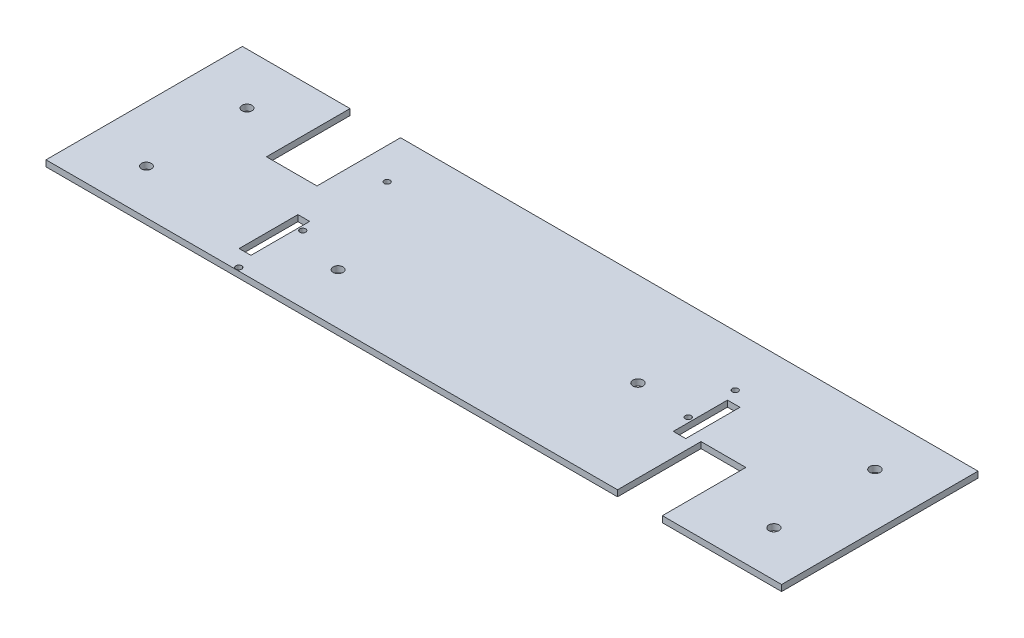
ISO-10303-21;
HEADER;
FILE_DESCRIPTION(('STEP AP214'),'2;1');
FILE_NAME('part.step','',(''),(''),'','','');
FILE_SCHEMA(('AUTOMOTIVE_DESIGN { 1 0 10303 214 1 1 1 1 }'));
ENDSEC;
DATA;
#1=APPLICATION_CONTEXT('core data for automotive mechanical design processes');
#2=APPLICATION_PROTOCOL_DEFINITION('international standard','automotive_design',2000,#1);
#3=PRODUCT_CONTEXT('',#1,'mechanical');
#4=PRODUCT('Part','Part','',(#3));
#5=PRODUCT_RELATED_PRODUCT_CATEGORY('part','',(#4));
#6=PRODUCT_DEFINITION_FORMATION('','',#4);
#7=PRODUCT_DEFINITION_CONTEXT('part definition',#1,'design');
#8=PRODUCT_DEFINITION('design','',#6,#7);
#9=PRODUCT_DEFINITION_SHAPE('','',#8);
#10=(LENGTH_UNIT() NAMED_UNIT(*) SI_UNIT(.MILLI.,.METRE.));
#11=(NAMED_UNIT(*) PLANE_ANGLE_UNIT() SI_UNIT($,.RADIAN.));
#12=(NAMED_UNIT(*) SI_UNIT($,.STERADIAN.) SOLID_ANGLE_UNIT());
#13=UNCERTAINTY_MEASURE_WITH_UNIT(LENGTH_MEASURE(1.E-05),#10,'distance_accuracy_value','');
#14=(GEOMETRIC_REPRESENTATION_CONTEXT(3) GLOBAL_UNCERTAINTY_ASSIGNED_CONTEXT((#13)) GLOBAL_UNIT_ASSIGNED_CONTEXT((#10,
#11,#12)) REPRESENTATION_CONTEXT('',''));
#15=CARTESIAN_POINT('',(0.,0.,0.));
#16=DIRECTION('',(0.,0.,1.));
#17=DIRECTION('',(1.,0.,0.));
#18=AXIS2_PLACEMENT_3D('',#15,#16,#17);
#19=CARTESIAN_POINT('',(-191.516,3.175,50.8));
#20=DIRECTION('',(0.,0.,-1.));
#21=DIRECTION('',(-1.,0.,0.));
#22=AXIS2_PLACEMENT_3D('',#19,#20,#21);
#23=PLANE('',#22);
#24=DIRECTION('',(1.,0.,0.));
#25=VECTOR('',#24,1.);
#26=CARTESIAN_POINT('',(-191.516,3.175,50.8));
#27=LINE('',#26,#25);
#28=CARTESIAN_POINT('',(-189.030522811123,3.175,50.8));
#29=VERTEX_POINT('',#28);
#30=CARTESIAN_POINT('',(106.633964595742,3.175,50.8));
#31=VERTEX_POINT('',#30);
#32=EDGE_CURVE('E189',#29,#31,#27,.T.);
#33=ORIENTED_EDGE('',*,*,#32,.F.);
#34=DIRECTION('',(0.,-1.,0.));
#35=VECTOR('',#34,1.);
#36=CARTESIAN_POINT('',(-189.030522811123,3.175,50.8));
#37=LINE('',#36,#35);
#38=CARTESIAN_POINT('',(-189.030522811123,0.,50.8));
#39=VERTEX_POINT('',#38);
#40=EDGE_CURVE('E176',#29,#39,#37,.T.);
#41=ORIENTED_EDGE('',*,*,#40,.T.);
#42=DIRECTION('',(1.,0.,0.));
#43=VECTOR('',#42,1.);
#44=CARTESIAN_POINT('',(-191.516,0.,50.8));
#45=LINE('',#44,#43);
#46=CARTESIAN_POINT('',(106.633964595742,0.,50.8));
#47=VERTEX_POINT('',#46);
#48=EDGE_CURVE('E217',#39,#47,#45,.T.);
#49=ORIENTED_EDGE('',*,*,#48,.T.);
#50=DIRECTION('',(0.,1.,0.));
#51=VECTOR('',#50,1.);
#52=CARTESIAN_POINT('',(106.633964595742,-1.905,50.8));
#53=LINE('',#52,#51);
#54=EDGE_CURVE('E197',#47,#31,#53,.T.);
#55=ORIENTED_EDGE('',*,*,#54,.T.);
#56=EDGE_LOOP('',(#33,#41,#49,#55));
#57=FACE_BOUND('',#56,.T.);
#58=ADVANCED_FACE('F41',(#57),#23,.F.);
#59=CARTESIAN_POINT('',(0.,3.175,0.));
#60=DIRECTION('',(0.,-1.,0.));
#61=DIRECTION('',(0.,0.,-1.));
#62=AXIS2_PLACEMENT_3D('',#59,#60,#61);
#63=PLANE('',#62);
#64=CARTESIAN_POINT('',(64.135,3.175,-2.28599999999998));
#65=DIRECTION('',(0.,1.,0.));
#66=DIRECTION('',(0.,0.,1.));
#67=AXIS2_PLACEMENT_3D('',#64,#65,#66);
#68=CIRCLE('',#67,2.65729792765995);
#69=CARTESIAN_POINT('',(64.135,3.175,0.37129792765997));
#70=VERTEX_POINT('',#69);
#71=EDGE_CURVE('E271',#70,#70,#68,.T.);
#72=ORIENTED_EDGE('',*,*,#71,.F.);
#73=EDGE_LOOP('',(#72));
#74=FACE_BOUND('',#73,.T.);
#75=CARTESIAN_POINT('',(92.456,3.175,0.));
#76=DIRECTION('',(0.,1.,0.));
#77=DIRECTION('',(0.,0.,1.));
#78=AXIS2_PLACEMENT_3D('',#75,#76,#77);
#79=CIRCLE('',#78,1.52399999999999);
#80=CARTESIAN_POINT('',(92.456,3.175,1.52399999999999));
#81=VERTEX_POINT('',#80);
#82=EDGE_CURVE('E183',#81,#81,#79,.T.);
#83=ORIENTED_EDGE('',*,*,#82,.F.);
#84=EDGE_LOOP('',(#83));
#85=FACE_BOUND('',#84,.T.);
#86=CARTESIAN_POINT('',(164.10340160592,3.175,27.3725679526237));
#87=DIRECTION('',(0.,1.,0.));
#88=DIRECTION('',(0.,0.,1.));
#89=AXIS2_PLACEMENT_3D('',#86,#87,#88);
#90=CIRCLE('',#89,2.61409985009302);
#91=CARTESIAN_POINT('',(164.10340160592,3.175,29.9866678027167));
#92=VERTEX_POINT('',#91);
#93=EDGE_CURVE('E376',#92,#92,#90,.T.);
#94=ORIENTED_EDGE('',*,*,#93,.F.);
#95=EDGE_LOOP('',(#94));
#96=FACE_BOUND('',#95,.T.);
#97=CARTESIAN_POINT('',(164.10340160592,3.175,-24.8839194126842));
#98=DIRECTION('',(0.,1.,0.));
#99=DIRECTION('',(0.,0.,1.));
#100=AXIS2_PLACEMENT_3D('',#97,#98,#99);
#101=CIRCLE('',#100,2.65364974901954);
#102=CARTESIAN_POINT('',(164.10340160592,3.175,-22.2302696636647));
#103=VERTEX_POINT('',#102);
#104=EDGE_CURVE('E379',#103,#103,#101,.T.);
#105=ORIENTED_EDGE('',*,*,#104,.F.);
#106=EDGE_LOOP('',(#105));
#107=FACE_BOUND('',#106,.T.);
#108=CARTESIAN_POINT('',(-160.218440267836,3.175,-24.384));
#109=DIRECTION('',(0.,1.,0.));
#110=DIRECTION('',(0.,0.,1.));
#111=AXIS2_PLACEMENT_3D('',#108,#109,#110);
#112=CIRCLE('',#111,2.53999999999998);
#113=CARTESIAN_POINT('',(-160.218440267836,3.175,-21.844));
#114=VERTEX_POINT('',#113);
#115=EDGE_CURVE('E227',#114,#114,#112,.T.);
#116=ORIENTED_EDGE('',*,*,#115,.F.);
#117=EDGE_LOOP('',(#116));
#118=FACE_BOUND('',#117,.T.);
#119=CARTESIAN_POINT('',(-64.258101600192,3.175,24.4736004243686));
#120=DIRECTION('',(0.,1.,0.));
#121=DIRECTION('',(0.,0.,1.));
#122=AXIS2_PLACEMENT_3D('',#119,#120,#121);
#123=CIRCLE('',#122,2.54);
#124=CARTESIAN_POINT('',(-64.258101600192,3.175,27.0136004243686));
#125=VERTEX_POINT('',#124);
#126=EDGE_CURVE('E287',#125,#125,#123,.T.);
#127=ORIENTED_EDGE('',*,*,#126,.F.);
#128=EDGE_LOOP('',(#127));
#129=FACE_BOUND('',#128,.T.);
#130=CARTESIAN_POINT('',(-90.932,3.175,-27.5708810877318));
#131=DIRECTION('',(0.,1.,0.));
#132=DIRECTION('',(0.,0.,1.));
#133=AXIS2_PLACEMENT_3D('',#130,#131,#132);
#134=CIRCLE('',#133,1.52399999999999);
#135=CARTESIAN_POINT('',(-90.932,3.175,-26.0468810877319));
#136=VERTEX_POINT('',#135);
#137=EDGE_CURVE('E291',#136,#136,#134,.T.);
#138=ORIENTED_EDGE('',*,*,#137,.F.);
#139=EDGE_LOOP('',(#138));
#140=FACE_BOUND('',#139,.T.);
#141=CARTESIAN_POINT('',(-90.932,3.175,16.0762631729649));
#142=DIRECTION('',(0.,1.,0.));
#143=DIRECTION('',(0.,0.,1.));
#144=AXIS2_PLACEMENT_3D('',#141,#142,#143);
#145=CIRCLE('',#144,1.52399999999999);
#146=CARTESIAN_POINT('',(-90.932,3.175,17.6002631729649));
#147=VERTEX_POINT('',#146);
#148=EDGE_CURVE('E296',#147,#147,#145,.T.);
#149=ORIENTED_EDGE('',*,*,#148,.F.);
#150=EDGE_LOOP('',(#149));
#151=FACE_BOUND('',#150,.T.);
#152=CARTESIAN_POINT('',(-90.932,3.175,49.149));
#153=DIRECTION('',(0.,1.,0.));
#154=DIRECTION('',(0.,0.,1.));
#155=AXIS2_PLACEMENT_3D('',#152,#153,#154);
#156=CIRCLE('',#155,1.52399999999999);
#157=CARTESIAN_POINT('',(-90.932,3.175,50.673));
#158=VERTEX_POINT('',#157);
#159=EDGE_CURVE('E331',#158,#158,#156,.T.);
#160=ORIENTED_EDGE('',*,*,#159,.F.);
#161=EDGE_LOOP('',(#160));
#162=FACE_BOUND('',#161,.T.);
#163=DIRECTION('',(-1.,0.,0.));
#164=VECTOR('',#163,1.);
#165=CARTESIAN_POINT('',(-99.314,3.175,10.1847171604173));
#166=LINE('',#165,#164);
#167=CARTESIAN_POINT('',(-93.218,3.175,10.1847171604173));
#168=VERTEX_POINT('',#167);
#169=CARTESIAN_POINT('',(-99.314,3.175,10.1847171604173));
#170=VERTEX_POINT('',#169);
#171=EDGE_CURVE('E337',#168,#170,#166,.T.);
#172=ORIENTED_EDGE('',*,*,#171,.F.);
#173=DIRECTION('',(0.,0.,-1.));
#174=VECTOR('',#173,1.);
#175=CARTESIAN_POINT('',(-93.218,3.175,40.5996258222566));
#176=LINE('',#175,#174);
#177=CARTESIAN_POINT('',(-93.218,3.175,40.5996258222566));
#178=VERTEX_POINT('',#177);
#179=EDGE_CURVE('E314',#178,#168,#176,.T.);
#180=ORIENTED_EDGE('',*,*,#179,.F.);
#181=DIRECTION('',(1.,0.,0.));
#182=VECTOR('',#181,1.);
#183=CARTESIAN_POINT('',(-99.314,3.175,40.5996258222566));
#184=LINE('',#183,#182);
#185=CARTESIAN_POINT('',(-99.314,3.175,40.5996258222566));
#186=VERTEX_POINT('',#185);
#187=EDGE_CURVE('E324',#186,#178,#184,.T.);
#188=ORIENTED_EDGE('',*,*,#187,.F.);
#189=DIRECTION('',(0.,0.,1.));
#190=VECTOR('',#189,1.);
#191=CARTESIAN_POINT('',(-99.314,3.175,40.5996258222566));
#192=LINE('',#191,#190);
#193=EDGE_CURVE('E334',#170,#186,#192,.T.);
#194=ORIENTED_EDGE('',*,*,#193,.F.);
#195=EDGE_LOOP('',(#172,#180,#188,#194));
#196=FACE_BOUND('',#195,.T.);
#197=CARTESIAN_POINT('',(-160.218440267836,3.175,27.6640052129043));
#198=DIRECTION('',(0.,1.,0.));
#199=DIRECTION('',(0.,0.,1.));
#200=AXIS2_PLACEMENT_3D('',#197,#198,#199);
#201=CIRCLE('',#200,2.53999999999998);
#202=CARTESIAN_POINT('',(-160.218440267836,3.175,30.2040052129043));
#203=VERTEX_POINT('',#202);
#204=EDGE_CURVE('E300',#203,#203,#201,.T.);
#205=ORIENTED_EDGE('',*,*,#204,.F.);
#206=EDGE_LOOP('',(#205));
#207=FACE_BOUND('',#206,.T.);
#208=DIRECTION('',(0.,0.,1.));
#209=VECTOR('',#208,1.);
#210=CARTESIAN_POINT('',(94.8920106895122,3.175,0.));
#211=LINE('',#210,#209);
#212=CARTESIAN_POINT('',(94.8920106895122,3.175,-17.811952579015));
#213=VERTEX_POINT('',#212);
#214=CARTESIAN_POINT('',(94.8920106895122,3.175,10.2225634884164));
#215=VERTEX_POINT('',#214);
#216=EDGE_CURVE('E383',#213,#215,#211,.T.);
#217=ORIENTED_EDGE('',*,*,#216,.F.);
#218=DIRECTION('',(-1.,0.,0.));
#219=VECTOR('',#218,1.);
#220=CARTESIAN_POINT('',(0.,3.175,-17.811952579015));
#221=LINE('',#220,#219);
#222=CARTESIAN_POINT('',(101.346,3.175,-17.811952579015));
#223=VERTEX_POINT('',#222);
#224=EDGE_CURVE('E63',#223,#213,#221,.T.);
#225=ORIENTED_EDGE('',*,*,#224,.F.);
#226=DIRECTION('',(0.,0.,1.));
#227=VECTOR('',#226,1.);
#228=CARTESIAN_POINT('',(101.346,3.175,0.));
#229=LINE('',#228,#227);
#230=CARTESIAN_POINT('',(101.346,3.175,10.2225634884164));
#231=VERTEX_POINT('',#230);
#232=EDGE_CURVE('E390',#223,#231,#229,.T.);
#233=ORIENTED_EDGE('',*,*,#232,.T.);
#234=DIRECTION('',(-1.,0.,0.));
#235=VECTOR('',#234,1.);
#236=CARTESIAN_POINT('',(0.,3.175,10.2225634884164));
#237=LINE('',#236,#235);
#238=EDGE_CURVE('E387',#231,#215,#237,.T.);
#239=ORIENTED_EDGE('',*,*,#238,.T.);
#240=EDGE_LOOP('',(#217,#225,#233,#239));
#241=FACE_BOUND('',#240,.T.);
#242=CARTESIAN_POINT('',(92.456,3.175,-24.257));
#243=DIRECTION('',(0.,1.,0.));
#244=DIRECTION('',(0.,0.,1.));
#245=AXIS2_PLACEMENT_3D('',#242,#243,#244);
#246=CIRCLE('',#245,1.52399999999999);
#247=CARTESIAN_POINT('',(92.456,3.175,-22.733));
#248=VERTEX_POINT('',#247);
#249=EDGE_CURVE('E384',#248,#248,#246,.T.);
#250=ORIENTED_EDGE('',*,*,#249,.F.);
#251=EDGE_LOOP('',(#250));
#252=FACE_BOUND('',#251,.T.);
#253=DIRECTION('',(-1.,0.,0.));
#254=VECTOR('',#253,1.);
#255=CARTESIAN_POINT('',(-191.516,3.175,-50.8));
#256=LINE('',#255,#254);
#257=CARTESIAN_POINT('',(-133.35,3.175,-50.8));
#258=VERTEX_POINT('',#257);
#259=CARTESIAN_POINT('',(-189.030522811123,3.175,-50.8));
#260=VERTEX_POINT('',#259);
#261=EDGE_CURVE('E193',#258,#260,#256,.T.);
#262=ORIENTED_EDGE('',*,*,#261,.T.);
#263=DIRECTION('',(0.,0.,-1.));
#264=VECTOR('',#263,1.);
#265=CARTESIAN_POINT('',(-189.030522811123,3.175,-60.1541890343234));
#266=LINE('',#265,#264);
#267=EDGE_CURVE('E56',#29,#260,#266,.T.);
#268=ORIENTED_EDGE('',*,*,#267,.F.);
#269=ORIENTED_EDGE('',*,*,#32,.T.);
#270=DIRECTION('',(0.,0.,-1.));
#271=VECTOR('',#270,1.);
#272=CARTESIAN_POINT('',(106.633964595742,3.175,0.));
#273=LINE('',#272,#271);
#274=CARTESIAN_POINT('',(106.633964595742,3.175,7.6006303310307));
#275=VERTEX_POINT('',#274);
#276=EDGE_CURVE('E403',#31,#275,#273,.T.);
#277=ORIENTED_EDGE('',*,*,#276,.T.);
#278=DIRECTION('',(-1.,0.,0.));
#279=VECTOR('',#278,1.);
#280=CARTESIAN_POINT('',(0.,3.175,7.6006303310307));
#281=LINE('',#280,#279);
#282=CARTESIAN_POINT('',(129.827988680307,3.175,7.6006303310307));
#283=VERTEX_POINT('',#282);
#284=EDGE_CURVE('E408',#283,#275,#281,.T.);
#285=ORIENTED_EDGE('',*,*,#284,.F.);
#286=DIRECTION('',(0.,0.,-1.));
#287=VECTOR('',#286,1.);
#288=CARTESIAN_POINT('',(129.827988680307,3.175,0.));
#289=LINE('',#288,#287);
#290=CARTESIAN_POINT('',(129.827988680307,3.175,50.8));
#291=VERTEX_POINT('',#290);
#292=EDGE_CURVE('E405',#291,#283,#289,.T.);
#293=ORIENTED_EDGE('',*,*,#292,.F.);
#294=CARTESIAN_POINT('',(191.516,3.175,50.8));
#295=VERTEX_POINT('',#294);
#296=EDGE_CURVE('E199',#291,#295,#27,.T.);
#297=ORIENTED_EDGE('',*,*,#296,.T.);
#298=DIRECTION('',(0.,0.,-1.));
#299=VECTOR('',#298,1.);
#300=CARTESIAN_POINT('',(191.516,3.175,50.8));
#301=LINE('',#300,#299);
#302=CARTESIAN_POINT('',(191.516,3.175,-50.8));
#303=VERTEX_POINT('',#302);
#304=EDGE_CURVE('E218',#295,#303,#301,.T.);
#305=ORIENTED_EDGE('',*,*,#304,.T.);
#306=CARTESIAN_POINT('',(-107.221756317346,3.175,-50.8));
#307=VERTEX_POINT('',#306);
#308=EDGE_CURVE('E204',#303,#307,#256,.T.);
#309=ORIENTED_EDGE('',*,*,#308,.T.);
#310=DIRECTION('',(0.,0.,-1.));
#311=VECTOR('',#310,1.);
#312=CARTESIAN_POINT('',(-107.221756317346,3.175,-50.8));
#313=LINE('',#312,#311);
#314=CARTESIAN_POINT('',(-107.221756317346,3.175,-7.57432346763659));
#315=VERTEX_POINT('',#314);
#316=EDGE_CURVE('E306',#315,#307,#313,.T.);
#317=ORIENTED_EDGE('',*,*,#316,.F.);
#318=DIRECTION('',(1.,0.,0.));
#319=VECTOR('',#318,1.);
#320=CARTESIAN_POINT('',(-133.35,3.175,-7.57432346763659));
#321=LINE('',#320,#319);
#322=CARTESIAN_POINT('',(-133.35,3.175,-7.57432346763659));
#323=VERTEX_POINT('',#322);
#324=EDGE_CURVE('E316',#323,#315,#321,.T.);
#325=ORIENTED_EDGE('',*,*,#324,.F.);
#326=DIRECTION('',(0.,0.,1.));
#327=VECTOR('',#326,1.);
#328=CARTESIAN_POINT('',(-133.35,3.175,-50.8));
#329=LINE('',#328,#327);
#330=EDGE_CURVE('E303',#258,#323,#329,.T.);
#331=ORIENTED_EDGE('',*,*,#330,.F.);
#332=EDGE_LOOP('',(#262,#268,#269,#277,#285,#293,#297,#305,#309,#317,#325,#331));
#333=FACE_BOUND('',#332,.T.);
#334=ADVANCED_FACE('F187',(#74,#85,#96,#107,#118,#129,#140,#151,#162,#196,#207,#241,#252,#333),
#63,.F.);
#335=CARTESIAN_POINT('',(0.,0.,0.));
#336=DIRECTION('',(0.,-1.,0.));
#337=DIRECTION('',(0.,0.,-1.));
#338=AXIS2_PLACEMENT_3D('',#335,#336,#337);
#339=PLANE('',#338);
#340=DIRECTION('',(0.,0.,1.));
#341=VECTOR('',#340,1.);
#342=CARTESIAN_POINT('',(-189.030522811123,0.,0.));
#343=LINE('',#342,#341);
#344=CARTESIAN_POINT('',(-189.030522811123,0.,-50.8));
#345=VERTEX_POINT('',#344);
#346=EDGE_CURVE('E179',#345,#39,#343,.T.);
#347=ORIENTED_EDGE('',*,*,#346,.F.);
#348=DIRECTION('',(-1.,0.,0.));
#349=VECTOR('',#348,1.);
#350=CARTESIAN_POINT('',(-191.516,0.,-50.8));
#351=LINE('',#350,#349);
#352=CARTESIAN_POINT('',(-133.35,0.,-50.8));
#353=VERTEX_POINT('',#352);
#354=EDGE_CURVE('E211',#353,#345,#351,.T.);
#355=ORIENTED_EDGE('',*,*,#354,.F.);
#356=DIRECTION('',(0.,0.,-1.));
#357=VECTOR('',#356,1.);
#358=CARTESIAN_POINT('',(-133.35,0.,0.));
#359=LINE('',#358,#357);
#360=CARTESIAN_POINT('',(-133.35,0.,-7.57432346763659));
#361=VERTEX_POINT('',#360);
#362=EDGE_CURVE('E252',#361,#353,#359,.T.);
#363=ORIENTED_EDGE('',*,*,#362,.F.);
#364=DIRECTION('',(-1.,0.,0.));
#365=VECTOR('',#364,1.);
#366=CARTESIAN_POINT('',(0.,0.,-7.57432346763659));
#367=LINE('',#366,#365);
#368=CARTESIAN_POINT('',(-107.221756317346,0.,-7.57432346763659));
#369=VERTEX_POINT('',#368);
#370=EDGE_CURVE('E247',#369,#361,#367,.T.);
#371=ORIENTED_EDGE('',*,*,#370,.F.);
#372=DIRECTION('',(0.,0.,1.));
#373=VECTOR('',#372,1.);
#374=CARTESIAN_POINT('',(-107.221756317346,0.,0.));
#375=LINE('',#374,#373);
#376=CARTESIAN_POINT('',(-107.221756317346,0.,-50.8));
#377=VERTEX_POINT('',#376);
#378=EDGE_CURVE('E249',#377,#369,#375,.T.);
#379=ORIENTED_EDGE('',*,*,#378,.F.);
#380=CARTESIAN_POINT('',(191.516,0.,-50.8));
#381=VERTEX_POINT('',#380);
#382=EDGE_CURVE('E213',#381,#377,#351,.T.);
#383=ORIENTED_EDGE('',*,*,#382,.F.);
#384=DIRECTION('',(0.,0.,-1.));
#385=VECTOR('',#384,1.);
#386=CARTESIAN_POINT('',(191.516,0.,50.8));
#387=LINE('',#386,#385);
#388=CARTESIAN_POINT('',(191.516,0.,50.8));
#389=VERTEX_POINT('',#388);
#390=EDGE_CURVE('E208',#389,#381,#387,.T.);
#391=ORIENTED_EDGE('',*,*,#390,.F.);
#392=CARTESIAN_POINT('',(129.827988680307,0.,50.8));
#393=VERTEX_POINT('',#392);
#394=EDGE_CURVE('E216',#393,#389,#45,.T.);
#395=ORIENTED_EDGE('',*,*,#394,.F.);
#396=DIRECTION('',(0.,0.,1.));
#397=VECTOR('',#396,1.);
#398=CARTESIAN_POINT('',(129.827988680307,0.,0.));
#399=LINE('',#398,#397);
#400=CARTESIAN_POINT('',(129.827988680307,0.,7.6006303310307));
#401=VERTEX_POINT('',#400);
#402=EDGE_CURVE('E266',#401,#393,#399,.T.);
#403=ORIENTED_EDGE('',*,*,#402,.F.);
#404=DIRECTION('',(1.,0.,0.));
#405=VECTOR('',#404,1.);
#406=CARTESIAN_POINT('',(0.,0.,7.6006303310307));
#407=LINE('',#406,#405);
#408=CARTESIAN_POINT('',(106.633964595742,0.,7.6006303310307));
#409=VERTEX_POINT('',#408);
#410=EDGE_CURVE('E273',#409,#401,#407,.T.);
#411=ORIENTED_EDGE('',*,*,#410,.F.);
#412=DIRECTION('',(0.,0.,1.));
#413=VECTOR('',#412,1.);
#414=CARTESIAN_POINT('',(106.633964595742,0.,0.));
#415=LINE('',#414,#413);
#416=EDGE_CURVE('E49',#409,#47,#415,.T.);
#417=ORIENTED_EDGE('',*,*,#416,.T.);
#418=ORIENTED_EDGE('',*,*,#48,.F.);
#419=EDGE_LOOP('',(#347,#355,#363,#371,#379,#383,#391,#395,#403,#411,#417,#418));
#420=FACE_BOUND('',#419,.T.);
#421=CARTESIAN_POINT('',(64.135,0.,-2.28599999999998));
#422=DIRECTION('',(0.,-1.,0.));
#423=DIRECTION('',(0.,0.,-1.));
#424=AXIS2_PLACEMENT_3D('',#421,#422,#423);
#425=CIRCLE('',#424,2.65729792765995);
#426=CARTESIAN_POINT('',(64.135,0.,-4.94329792765993));
#427=VERTEX_POINT('',#426);
#428=EDGE_CURVE('E285',#427,#427,#425,.T.);
#429=ORIENTED_EDGE('',*,*,#428,.F.);
#430=EDGE_LOOP('',(#429));
#431=FACE_BOUND('',#430,.T.);
#432=CARTESIAN_POINT('',(92.456,0.,0.));
#433=DIRECTION('',(0.,-1.,0.));
#434=DIRECTION('',(0.,0.,-1.));
#435=AXIS2_PLACEMENT_3D('',#432,#433,#434);
#436=CIRCLE('',#435,1.52399999999999);
#437=CARTESIAN_POINT('',(92.456,0.,-1.52399999999999));
#438=VERTEX_POINT('',#437);
#439=EDGE_CURVE('E283',#438,#438,#436,.T.);
#440=ORIENTED_EDGE('',*,*,#439,.F.);
#441=EDGE_LOOP('',(#440));
#442=FACE_BOUND('',#441,.T.);
#443=CARTESIAN_POINT('',(164.10340160592,0.,27.3725679526237));
#444=DIRECTION('',(0.,-1.,0.));
#445=DIRECTION('',(0.,0.,-1.));
#446=AXIS2_PLACEMENT_3D('',#443,#444,#445);
#447=CIRCLE('',#446,2.61409985009302);
#448=CARTESIAN_POINT('',(164.10340160592,0.,24.7584681025306));
#449=VERTEX_POINT('',#448);
#450=EDGE_CURVE('E280',#449,#449,#447,.T.);
#451=ORIENTED_EDGE('',*,*,#450,.F.);
#452=EDGE_LOOP('',(#451));
#453=FACE_BOUND('',#452,.T.);
#454=CARTESIAN_POINT('',(164.10340160592,0.,-24.8839194126842));
#455=DIRECTION('',(0.,-1.,0.));
#456=DIRECTION('',(0.,0.,-1.));
#457=AXIS2_PLACEMENT_3D('',#454,#455,#456);
#458=CIRCLE('',#457,2.65364974901954);
#459=CARTESIAN_POINT('',(164.10340160592,0.,-27.5375691617038));
#460=VERTEX_POINT('',#459);
#461=EDGE_CURVE('E270',#460,#460,#458,.T.);
#462=ORIENTED_EDGE('',*,*,#461,.F.);
#463=EDGE_LOOP('',(#462));
#464=FACE_BOUND('',#463,.T.);
#465=CARTESIAN_POINT('',(92.456,0.,-24.257));
#466=DIRECTION('',(0.,-1.,0.));
#467=DIRECTION('',(0.,0.,-1.));
#468=AXIS2_PLACEMENT_3D('',#465,#466,#467);
#469=CIRCLE('',#468,1.52399999999999);
#470=CARTESIAN_POINT('',(92.456,0.,-25.781));
#471=VERTEX_POINT('',#470);
#472=EDGE_CURVE('E267',#471,#471,#469,.T.);
#473=ORIENTED_EDGE('',*,*,#472,.F.);
#474=EDGE_LOOP('',(#473));
#475=FACE_BOUND('',#474,.T.);
#476=DIRECTION('',(1.,0.,0.));
#477=VECTOR('',#476,1.);
#478=CARTESIAN_POINT('',(0.,0.,-17.811952579015));
#479=LINE('',#478,#477);
#480=CARTESIAN_POINT('',(94.8920106895122,0.,-17.811952579015));
#481=VERTEX_POINT('',#480);
#482=CARTESIAN_POINT('',(101.346,0.,-17.811952579015));
#483=VERTEX_POINT('',#482);
#484=EDGE_CURVE('E264',#481,#483,#479,.T.);
#485=ORIENTED_EDGE('',*,*,#484,.F.);
#486=DIRECTION('',(0.,0.,-1.));
#487=VECTOR('',#486,1.);
#488=CARTESIAN_POINT('',(94.8920106895122,0.,0.));
#489=LINE('',#488,#487);
#490=CARTESIAN_POINT('',(94.8920106895122,0.,10.2225634884164));
#491=VERTEX_POINT('',#490);
#492=EDGE_CURVE('E254',#491,#481,#489,.T.);
#493=ORIENTED_EDGE('',*,*,#492,.F.);
#494=DIRECTION('',(1.,0.,0.));
#495=VECTOR('',#494,1.);
#496=CARTESIAN_POINT('',(0.,0.,10.2225634884164));
#497=LINE('',#496,#495);
#498=CARTESIAN_POINT('',(101.346,0.,10.2225634884164));
#499=VERTEX_POINT('',#498);
#500=EDGE_CURVE('E258',#491,#499,#497,.T.);
#501=ORIENTED_EDGE('',*,*,#500,.T.);
#502=DIRECTION('',(0.,0.,-1.));
#503=VECTOR('',#502,1.);
#504=CARTESIAN_POINT('',(101.346,0.,0.));
#505=LINE('',#504,#503);
#506=EDGE_CURVE('E261',#499,#483,#505,.T.);
#507=ORIENTED_EDGE('',*,*,#506,.T.);
#508=EDGE_LOOP('',(#485,#493,#501,#507));
#509=FACE_BOUND('',#508,.T.);
#510=CARTESIAN_POINT('',(-160.218440267836,0.,27.6640052129043));
#511=DIRECTION('',(0.,-1.,0.));
#512=DIRECTION('',(0.,0.,-1.));
#513=AXIS2_PLACEMENT_3D('',#510,#511,#512);
#514=CIRCLE('',#513,2.53999999999998);
#515=CARTESIAN_POINT('',(-160.218440267836,0.,25.1240052129043));
#516=VERTEX_POINT('',#515);
#517=EDGE_CURVE('E212',#516,#516,#514,.T.);
#518=ORIENTED_EDGE('',*,*,#517,.F.);
#519=EDGE_LOOP('',(#518));
#520=FACE_BOUND('',#519,.T.);
#521=DIRECTION('',(0.,0.,1.));
#522=VECTOR('',#521,1.);
#523=CARTESIAN_POINT('',(-93.218,0.,0.));
#524=LINE('',#523,#522);
#525=CARTESIAN_POINT('',(-93.218,0.,10.1847171604173));
#526=VERTEX_POINT('',#525);
#527=CARTESIAN_POINT('',(-93.218,0.,40.5996258222566));
#528=VERTEX_POINT('',#527);
#529=EDGE_CURVE('E245',#526,#528,#524,.T.);
#530=ORIENTED_EDGE('',*,*,#529,.F.);
#531=DIRECTION('',(1.,0.,0.));
#532=VECTOR('',#531,1.);
#533=CARTESIAN_POINT('',(0.,0.,10.1847171604173));
#534=LINE('',#533,#532);
#535=CARTESIAN_POINT('',(-99.314,0.,10.1847171604173));
#536=VERTEX_POINT('',#535);
#537=EDGE_CURVE('E222',#536,#526,#534,.T.);
#538=ORIENTED_EDGE('',*,*,#537,.F.);
#539=DIRECTION('',(0.,0.,-1.));
#540=VECTOR('',#539,1.);
#541=CARTESIAN_POINT('',(-99.314,0.,0.));
#542=LINE('',#541,#540);
#543=CARTESIAN_POINT('',(-99.314,0.,40.5996258222566));
#544=VERTEX_POINT('',#543);
#545=EDGE_CURVE('E240',#544,#536,#542,.T.);
#546=ORIENTED_EDGE('',*,*,#545,.F.);
#547=DIRECTION('',(-1.,0.,0.));
#548=VECTOR('',#547,1.);
#549=CARTESIAN_POINT('',(0.,0.,40.5996258222566));
#550=LINE('',#549,#548);
#551=EDGE_CURVE('E243',#528,#544,#550,.T.);
#552=ORIENTED_EDGE('',*,*,#551,.F.);
#553=EDGE_LOOP('',(#530,#538,#546,#552));
#554=FACE_BOUND('',#553,.T.);
#555=CARTESIAN_POINT('',(-90.932,0.,49.149));
#556=DIRECTION('',(0.,-1.,0.));
#557=DIRECTION('',(0.,0.,-1.));
#558=AXIS2_PLACEMENT_3D('',#555,#556,#557);
#559=CIRCLE('',#558,1.52399999999999);
#560=CARTESIAN_POINT('',(-90.932,0.,47.625));
#561=VERTEX_POINT('',#560);
#562=EDGE_CURVE('E236',#561,#561,#559,.T.);
#563=ORIENTED_EDGE('',*,*,#562,.F.);
#564=EDGE_LOOP('',(#563));
#565=FACE_BOUND('',#564,.T.);
#566=CARTESIAN_POINT('',(-90.932,0.,16.0762631729649));
#567=DIRECTION('',(0.,-1.,0.));
#568=DIRECTION('',(0.,0.,-1.));
#569=AXIS2_PLACEMENT_3D('',#566,#567,#568);
#570=CIRCLE('',#569,1.52399999999999);
#571=CARTESIAN_POINT('',(-90.932,0.,14.5522631729649));
#572=VERTEX_POINT('',#571);
#573=EDGE_CURVE('E233',#572,#572,#570,.T.);
#574=ORIENTED_EDGE('',*,*,#573,.F.);
#575=EDGE_LOOP('',(#574));
#576=FACE_BOUND('',#575,.T.);
#577=CARTESIAN_POINT('',(-90.932,0.,-27.5708810877318));
#578=DIRECTION('',(0.,-1.,0.));
#579=DIRECTION('',(0.,0.,-1.));
#580=AXIS2_PLACEMENT_3D('',#577,#578,#579);
#581=CIRCLE('',#580,1.52399999999999);
#582=CARTESIAN_POINT('',(-90.932,0.,-29.0948810877318));
#583=VERTEX_POINT('',#582);
#584=EDGE_CURVE('E230',#583,#583,#581,.T.);
#585=ORIENTED_EDGE('',*,*,#584,.F.);
#586=EDGE_LOOP('',(#585));
#587=FACE_BOUND('',#586,.T.);
#588=CARTESIAN_POINT('',(-64.258101600192,0.,24.4736004243686));
#589=DIRECTION('',(0.,-1.,0.));
#590=DIRECTION('',(0.,0.,-1.));
#591=AXIS2_PLACEMENT_3D('',#588,#589,#590);
#592=CIRCLE('',#591,2.54);
#593=CARTESIAN_POINT('',(-64.258101600192,0.,21.9336004243686));
#594=VERTEX_POINT('',#593);
#595=EDGE_CURVE('E226',#594,#594,#592,.T.);
#596=ORIENTED_EDGE('',*,*,#595,.F.);
#597=EDGE_LOOP('',(#596));
#598=FACE_BOUND('',#597,.T.);
#599=CARTESIAN_POINT('',(-160.218440267836,0.,-24.384));
#600=DIRECTION('',(0.,-1.,0.));
#601=DIRECTION('',(0.,0.,-1.));
#602=AXIS2_PLACEMENT_3D('',#599,#600,#601);
#603=CIRCLE('',#602,2.53999999999998);
#604=CARTESIAN_POINT('',(-160.218440267836,0.,-26.924));
#605=VERTEX_POINT('',#604);
#606=EDGE_CURVE('E223',#605,#605,#603,.T.);
#607=ORIENTED_EDGE('',*,*,#606,.F.);
#608=EDGE_LOOP('',(#607));
#609=FACE_BOUND('',#608,.T.);
#610=ADVANCED_FACE('F357',(#420,#431,#442,#453,#464,#475,#509,#520,#554,#565,#576,#587,#598,
#609),#339,.T.);
#611=CARTESIAN_POINT('',(-191.516,3.175,-50.8));
#612=DIRECTION('',(0.,0.,1.));
#613=DIRECTION('',(1.,0.,0.));
#614=AXIS2_PLACEMENT_3D('',#611,#612,#613);
#615=PLANE('',#614);
#616=ORIENTED_EDGE('',*,*,#354,.T.);
#617=DIRECTION('',(0.,1.,0.));
#618=VECTOR('',#617,1.);
#619=CARTESIAN_POINT('',(-189.030522811123,3.175,-50.8));
#620=LINE('',#619,#618);
#621=EDGE_CURVE('E11',#345,#260,#620,.T.);
#622=ORIENTED_EDGE('',*,*,#621,.T.);
#623=ORIENTED_EDGE('',*,*,#261,.F.);
#624=DIRECTION('',(0.,1.,0.));
#625=VECTOR('',#624,1.);
#626=CARTESIAN_POINT('',(-133.35,-1.905,-50.8));
#627=LINE('',#626,#625);
#628=EDGE_CURVE('E312',#353,#258,#627,.T.);
#629=ORIENTED_EDGE('',*,*,#628,.F.);
#630=EDGE_LOOP('',(#616,#622,#623,#629));
#631=FACE_BOUND('',#630,.T.);
#632=ADVANCED_FACE('F370',(#631),#615,.F.);
#633=CARTESIAN_POINT('',(191.516,3.175,50.8));
#634=DIRECTION('',(-1.,0.,0.));
#635=DIRECTION('',(0.,0.,1.));
#636=AXIS2_PLACEMENT_3D('',#633,#634,#635);
#637=PLANE('',#636);
#638=ORIENTED_EDGE('',*,*,#390,.T.);
#639=DIRECTION('',(0.,-1.,0.));
#640=VECTOR('',#639,1.);
#641=CARTESIAN_POINT('',(191.516,3.175,-50.8));
#642=LINE('',#641,#640);
#643=EDGE_CURVE('E202',#303,#381,#642,.T.);
#644=ORIENTED_EDGE('',*,*,#643,.F.);
#645=ORIENTED_EDGE('',*,*,#304,.F.);
#646=DIRECTION('',(0.,-1.,0.));
#647=VECTOR('',#646,1.);
#648=CARTESIAN_POINT('',(191.516,3.175,50.8));
#649=LINE('',#648,#647);
#650=EDGE_CURVE('E198',#295,#389,#649,.T.);
#651=ORIENTED_EDGE('',*,*,#650,.T.);
#652=EDGE_LOOP('',(#638,#644,#645,#651));
#653=FACE_BOUND('',#652,.T.);
#654=ADVANCED_FACE('F43',(#653),#637,.F.);
#655=ORIENTED_EDGE('',*,*,#382,.T.);
#656=DIRECTION('',(0.,1.,0.));
#657=VECTOR('',#656,1.);
#658=CARTESIAN_POINT('',(-107.221756317346,-1.905,-50.8));
#659=LINE('',#658,#657);
#660=EDGE_CURVE('E309',#377,#307,#659,.T.);
#661=ORIENTED_EDGE('',*,*,#660,.T.);
#662=ORIENTED_EDGE('',*,*,#308,.F.);
#663=ORIENTED_EDGE('',*,*,#643,.T.);
#664=EDGE_LOOP('',(#655,#661,#662,#663));
#665=FACE_BOUND('',#664,.T.);
#666=ADVANCED_FACE('F351',(#665),#615,.F.);
#667=ORIENTED_EDGE('',*,*,#296,.F.);
#668=DIRECTION('',(0.,1.,0.));
#669=VECTOR('',#668,1.);
#670=CARTESIAN_POINT('',(129.827988680307,-1.905,50.8));
#671=LINE('',#670,#669);
#672=EDGE_CURVE('E414',#393,#291,#671,.T.);
#673=ORIENTED_EDGE('',*,*,#672,.F.);
#674=ORIENTED_EDGE('',*,*,#394,.T.);
#675=ORIENTED_EDGE('',*,*,#650,.F.);
#676=EDGE_LOOP('',(#667,#673,#674,#675));
#677=FACE_BOUND('',#676,.T.);
#678=ADVANCED_FACE('F459',(#677),#23,.F.);
#679=CARTESIAN_POINT('',(-160.218440267836,-1.905,-24.384));
#680=DIRECTION('',(0.,1.,0.));
#681=DIRECTION('',(0.,0.,1.));
#682=AXIS2_PLACEMENT_3D('',#679,#680,#681);
#683=CYLINDRICAL_SURFACE('',#682,2.53999999999998);
#684=ORIENTED_EDGE('',*,*,#606,.T.);
#685=EDGE_LOOP('',(#684));
#686=FACE_BOUND('',#685,.T.);
#687=ORIENTED_EDGE('',*,*,#115,.T.);
#688=EDGE_LOOP('',(#687));
#689=FACE_BOUND('',#688,.T.);
#690=ADVANCED_FACE('F465',(#686,#689),#683,.F.);
#691=CARTESIAN_POINT('',(-64.258101600192,-1.905,24.4736004243686));
#692=DIRECTION('',(0.,1.,0.));
#693=DIRECTION('',(0.,0.,1.));
#694=AXIS2_PLACEMENT_3D('',#691,#692,#693);
#695=CYLINDRICAL_SURFACE('',#694,2.54);
#696=ORIENTED_EDGE('',*,*,#595,.T.);
#697=EDGE_LOOP('',(#696));
#698=FACE_BOUND('',#697,.T.);
#699=ORIENTED_EDGE('',*,*,#126,.T.);
#700=EDGE_LOOP('',(#699));
#701=FACE_BOUND('',#700,.T.);
#702=ADVANCED_FACE('F472',(#698,#701),#695,.F.);
#703=CARTESIAN_POINT('',(-90.932,-1.905,-27.5708810877318));
#704=DIRECTION('',(0.,1.,0.));
#705=DIRECTION('',(0.,0.,1.));
#706=AXIS2_PLACEMENT_3D('',#703,#704,#705);
#707=CYLINDRICAL_SURFACE('',#706,1.52399999999999);
#708=ORIENTED_EDGE('',*,*,#584,.T.);
#709=EDGE_LOOP('',(#708));
#710=FACE_BOUND('',#709,.T.);
#711=ORIENTED_EDGE('',*,*,#137,.T.);
#712=EDGE_LOOP('',(#711));
#713=FACE_BOUND('',#712,.T.);
#714=ADVANCED_FACE('F530',(#710,#713),#707,.F.);
#715=CARTESIAN_POINT('',(-90.932,-1.905,16.0762631729649));
#716=DIRECTION('',(0.,1.,0.));
#717=DIRECTION('',(0.,0.,1.));
#718=AXIS2_PLACEMENT_3D('',#715,#716,#717);
#719=CYLINDRICAL_SURFACE('',#718,1.52399999999999);
#720=ORIENTED_EDGE('',*,*,#573,.T.);
#721=EDGE_LOOP('',(#720));
#722=FACE_BOUND('',#721,.T.);
#723=ORIENTED_EDGE('',*,*,#148,.T.);
#724=EDGE_LOOP('',(#723));
#725=FACE_BOUND('',#724,.T.);
#726=ADVANCED_FACE('F421',(#722,#725),#719,.F.);
#727=CARTESIAN_POINT('',(-90.932,-1.905,49.149));
#728=DIRECTION('',(0.,1.,0.));
#729=DIRECTION('',(0.,0.,1.));
#730=AXIS2_PLACEMENT_3D('',#727,#728,#729);
#731=CYLINDRICAL_SURFACE('',#730,1.52399999999999);
#732=ORIENTED_EDGE('',*,*,#562,.T.);
#733=EDGE_LOOP('',(#732));
#734=FACE_BOUND('',#733,.T.);
#735=ORIENTED_EDGE('',*,*,#159,.T.);
#736=EDGE_LOOP('',(#735));
#737=FACE_BOUND('',#736,.T.);
#738=ADVANCED_FACE('F498',(#734,#737),#731,.F.);
#739=CARTESIAN_POINT('',(-93.218,-1.905,40.5996258222566));
#740=DIRECTION('',(1.,0.,0.));
#741=DIRECTION('',(0.,0.,-1.));
#742=AXIS2_PLACEMENT_3D('',#739,#740,#741);
#743=PLANE('',#742);
#744=ORIENTED_EDGE('',*,*,#529,.T.);
#745=DIRECTION('',(0.,1.,0.));
#746=VECTOR('',#745,1.);
#747=CARTESIAN_POINT('',(-93.218,-1.905,40.5996258222566));
#748=LINE('',#747,#746);
#749=EDGE_CURVE('E329',#528,#178,#748,.T.);
#750=ORIENTED_EDGE('',*,*,#749,.T.);
#751=ORIENTED_EDGE('',*,*,#179,.T.);
#752=DIRECTION('',(0.,1.,0.));
#753=VECTOR('',#752,1.);
#754=CARTESIAN_POINT('',(-93.218,-1.905,10.1847171604173));
#755=LINE('',#754,#753);
#756=EDGE_CURVE('E321',#526,#168,#755,.T.);
#757=ORIENTED_EDGE('',*,*,#756,.F.);
#758=EDGE_LOOP('',(#744,#750,#751,#757));
#759=FACE_BOUND('',#758,.T.);
#760=ADVANCED_FACE('F501',(#759),#743,.F.);
#761=CARTESIAN_POINT('',(-99.314,-1.905,40.5996258222566));
#762=DIRECTION('',(0.,0.,1.));
#763=DIRECTION('',(1.,0.,0.));
#764=AXIS2_PLACEMENT_3D('',#761,#762,#763);
#765=PLANE('',#764);
#766=ORIENTED_EDGE('',*,*,#551,.T.);
#767=DIRECTION('',(0.,1.,0.));
#768=VECTOR('',#767,1.);
#769=CARTESIAN_POINT('',(-99.314,-1.905,40.5996258222566));
#770=LINE('',#769,#768);
#771=EDGE_CURVE('E327',#544,#186,#770,.T.);
#772=ORIENTED_EDGE('',*,*,#771,.T.);
#773=ORIENTED_EDGE('',*,*,#187,.T.);
#774=ORIENTED_EDGE('',*,*,#749,.F.);
#775=EDGE_LOOP('',(#766,#772,#773,#774));
#776=FACE_BOUND('',#775,.T.);
#777=ADVANCED_FACE('F503',(#776),#765,.F.);
#778=CARTESIAN_POINT('',(-99.314,-1.905,40.5996258222566));
#779=DIRECTION('',(-1.,0.,0.));
#780=DIRECTION('',(0.,0.,1.));
#781=AXIS2_PLACEMENT_3D('',#778,#779,#780);
#782=PLANE('',#781);
#783=ORIENTED_EDGE('',*,*,#545,.T.);
#784=DIRECTION('',(0.,1.,0.));
#785=VECTOR('',#784,1.);
#786=CARTESIAN_POINT('',(-99.314,-1.905,10.1847171604173));
#787=LINE('',#786,#785);
#788=EDGE_CURVE('E325',#536,#170,#787,.T.);
#789=ORIENTED_EDGE('',*,*,#788,.T.);
#790=ORIENTED_EDGE('',*,*,#193,.T.);
#791=ORIENTED_EDGE('',*,*,#771,.F.);
#792=EDGE_LOOP('',(#783,#789,#790,#791));
#793=FACE_BOUND('',#792,.T.);
#794=ADVANCED_FACE('F506',(#793),#782,.F.);
#795=CARTESIAN_POINT('',(-99.314,-1.905,10.1847171604173));
#796=DIRECTION('',(0.,0.,-1.));
#797=DIRECTION('',(-1.,0.,0.));
#798=AXIS2_PLACEMENT_3D('',#795,#796,#797);
#799=PLANE('',#798);
#800=ORIENTED_EDGE('',*,*,#537,.T.);
#801=ORIENTED_EDGE('',*,*,#756,.T.);
#802=ORIENTED_EDGE('',*,*,#171,.T.);
#803=ORIENTED_EDGE('',*,*,#788,.F.);
#804=EDGE_LOOP('',(#800,#801,#802,#803));
#805=FACE_BOUND('',#804,.T.);
#806=ADVANCED_FACE('F510',(#805),#799,.F.);
#807=CARTESIAN_POINT('',(-133.35,-1.905,-50.8));
#808=DIRECTION('',(-1.,0.,0.));
#809=DIRECTION('',(0.,0.,1.));
#810=AXIS2_PLACEMENT_3D('',#807,#808,#809);
#811=PLANE('',#810);
#812=ORIENTED_EDGE('',*,*,#362,.T.);
#813=ORIENTED_EDGE('',*,*,#628,.T.);
#814=ORIENTED_EDGE('',*,*,#330,.T.);
#815=DIRECTION('',(0.,1.,0.));
#816=VECTOR('',#815,1.);
#817=CARTESIAN_POINT('',(-133.35,-1.905,-7.57432346763659));
#818=LINE('',#817,#816);
#819=EDGE_CURVE('E304',#361,#323,#818,.T.);
#820=ORIENTED_EDGE('',*,*,#819,.F.);
#821=EDGE_LOOP('',(#812,#813,#814,#820));
#822=FACE_BOUND('',#821,.T.);
#823=ADVANCED_FACE('F366',(#822),#811,.F.);
#824=CARTESIAN_POINT('',(-107.221756317346,-1.905,-50.8));
#825=DIRECTION('',(1.,0.,0.));
#826=DIRECTION('',(0.,0.,-1.));
#827=AXIS2_PLACEMENT_3D('',#824,#825,#826);
#828=PLANE('',#827);
#829=ORIENTED_EDGE('',*,*,#378,.T.);
#830=DIRECTION('',(0.,1.,0.));
#831=VECTOR('',#830,1.);
#832=CARTESIAN_POINT('',(-107.221756317346,-1.905,-7.57432346763659));
#833=LINE('',#832,#831);
#834=EDGE_CURVE('E307',#369,#315,#833,.T.);
#835=ORIENTED_EDGE('',*,*,#834,.T.);
#836=ORIENTED_EDGE('',*,*,#316,.T.);
#837=ORIENTED_EDGE('',*,*,#660,.F.);
#838=EDGE_LOOP('',(#829,#835,#836,#837));
#839=FACE_BOUND('',#838,.T.);
#840=ADVANCED_FACE('F354',(#839),#828,.F.);
#841=CARTESIAN_POINT('',(-133.35,-1.905,-7.57432346763659));
#842=DIRECTION('',(0.,0.,1.));
#843=DIRECTION('',(1.,0.,0.));
#844=AXIS2_PLACEMENT_3D('',#841,#842,#843);
#845=PLANE('',#844);
#846=ORIENTED_EDGE('',*,*,#370,.T.);
#847=ORIENTED_EDGE('',*,*,#819,.T.);
#848=ORIENTED_EDGE('',*,*,#324,.T.);
#849=ORIENTED_EDGE('',*,*,#834,.F.);
#850=EDGE_LOOP('',(#846,#847,#848,#849));
#851=FACE_BOUND('',#850,.T.);
#852=ADVANCED_FACE('F364',(#851),#845,.F.);
#853=CARTESIAN_POINT('',(-160.218440267836,-1.905,27.6640052129043));
#854=DIRECTION('',(0.,1.,0.));
#855=DIRECTION('',(0.,0.,1.));
#856=AXIS2_PLACEMENT_3D('',#853,#854,#855);
#857=CYLINDRICAL_SURFACE('',#856,2.53999999999998);
#858=ORIENTED_EDGE('',*,*,#517,.T.);
#859=EDGE_LOOP('',(#858));
#860=FACE_BOUND('',#859,.T.);
#861=ORIENTED_EDGE('',*,*,#204,.T.);
#862=EDGE_LOOP('',(#861));
#863=FACE_BOUND('',#862,.T.);
#864=ADVANCED_FACE('F522',(#860,#863),#857,.F.);
#865=CARTESIAN_POINT('',(0.,-1.905,-17.811952579015));
#866=DIRECTION('',(0.,0.,-1.));
#867=DIRECTION('',(-1.,0.,0.));
#868=AXIS2_PLACEMENT_3D('',#865,#866,#867);
#869=PLANE('',#868);
#870=ORIENTED_EDGE('',*,*,#484,.T.);
#871=DIRECTION('',(0.,1.,0.));
#872=VECTOR('',#871,1.);
#873=CARTESIAN_POINT('',(101.346,-1.905,-17.811952579015));
#874=LINE('',#873,#872);
#875=EDGE_CURVE('E375',#483,#223,#874,.T.);
#876=ORIENTED_EDGE('',*,*,#875,.T.);
#877=ORIENTED_EDGE('',*,*,#224,.T.);
#878=DIRECTION('',(0.,1.,0.));
#879=VECTOR('',#878,1.);
#880=CARTESIAN_POINT('',(94.8920106895122,-1.905,-17.811952579015));
#881=LINE('',#880,#879);
#882=EDGE_CURVE('E393',#481,#213,#881,.T.);
#883=ORIENTED_EDGE('',*,*,#882,.F.);
#884=EDGE_LOOP('',(#870,#876,#877,#883));
#885=FACE_BOUND('',#884,.T.);
#886=ADVANCED_FACE('F526',(#885),#869,.F.);
#887=CARTESIAN_POINT('',(101.346,-1.905,0.));
#888=DIRECTION('',(-1.,0.,0.));
#889=DIRECTION('',(0.,0.,1.));
#890=AXIS2_PLACEMENT_3D('',#887,#888,#889);
#891=PLANE('',#890);
#892=DIRECTION('',(0.,1.,0.));
#893=VECTOR('',#892,1.);
#894=CARTESIAN_POINT('',(101.346,-1.905,10.2225634884164));
#895=LINE('',#894,#893);
#896=EDGE_CURVE('E395',#499,#231,#895,.T.);
#897=ORIENTED_EDGE('',*,*,#896,.T.);
#898=ORIENTED_EDGE('',*,*,#232,.F.);
#899=ORIENTED_EDGE('',*,*,#875,.F.);
#900=ORIENTED_EDGE('',*,*,#506,.F.);
#901=EDGE_LOOP('',(#897,#898,#899,#900));
#902=FACE_BOUND('',#901,.T.);
#903=ADVANCED_FACE('F597',(#902),#891,.T.);
#904=CARTESIAN_POINT('',(0.,-1.905,10.2225634884164));
#905=DIRECTION('',(0.,0.,-1.));
#906=DIRECTION('',(-1.,0.,0.));
#907=AXIS2_PLACEMENT_3D('',#904,#905,#906);
#908=PLANE('',#907);
#909=DIRECTION('',(0.,1.,0.));
#910=VECTOR('',#909,1.);
#911=CARTESIAN_POINT('',(94.8920106895122,-1.905,10.2225634884164));
#912=LINE('',#911,#910);
#913=EDGE_CURVE('E397',#491,#215,#912,.T.);
#914=ORIENTED_EDGE('',*,*,#913,.T.);
#915=ORIENTED_EDGE('',*,*,#238,.F.);
#916=ORIENTED_EDGE('',*,*,#896,.F.);
#917=ORIENTED_EDGE('',*,*,#500,.F.);
#918=EDGE_LOOP('',(#914,#915,#916,#917));
#919=FACE_BOUND('',#918,.T.);
#920=ADVANCED_FACE('F452',(#919),#908,.T.);
#921=CARTESIAN_POINT('',(94.8920106895122,-1.905,0.));
#922=DIRECTION('',(-1.,0.,0.));
#923=DIRECTION('',(0.,0.,1.));
#924=AXIS2_PLACEMENT_3D('',#921,#922,#923);
#925=PLANE('',#924);
#926=ORIENTED_EDGE('',*,*,#492,.T.);
#927=ORIENTED_EDGE('',*,*,#882,.T.);
#928=ORIENTED_EDGE('',*,*,#216,.T.);
#929=ORIENTED_EDGE('',*,*,#913,.F.);
#930=EDGE_LOOP('',(#926,#927,#928,#929));
#931=FACE_BOUND('',#930,.T.);
#932=ADVANCED_FACE('F442',(#931),#925,.F.);
#933=CARTESIAN_POINT('',(92.456,-1.905,-24.257));
#934=DIRECTION('',(0.,1.,0.));
#935=DIRECTION('',(0.,0.,1.));
#936=AXIS2_PLACEMENT_3D('',#933,#934,#935);
#937=CYLINDRICAL_SURFACE('',#936,1.52399999999999);
#938=ORIENTED_EDGE('',*,*,#472,.T.);
#939=EDGE_LOOP('',(#938));
#940=FACE_BOUND('',#939,.T.);
#941=ORIENTED_EDGE('',*,*,#249,.T.);
#942=EDGE_LOOP('',(#941));
#943=FACE_BOUND('',#942,.T.);
#944=ADVANCED_FACE('F439',(#940,#943),#937,.F.);
#945=CARTESIAN_POINT('',(106.633964595742,-1.905,0.));
#946=DIRECTION('',(1.,0.,0.));
#947=DIRECTION('',(0.,0.,-1.));
#948=AXIS2_PLACEMENT_3D('',#945,#946,#947);
#949=PLANE('',#948);
#950=DIRECTION('',(0.,1.,0.));
#951=VECTOR('',#950,1.);
#952=CARTESIAN_POINT('',(106.633964595742,-1.905,7.6006303310307));
#953=LINE('',#952,#951);
#954=EDGE_CURVE('E402',#409,#275,#953,.T.);
#955=ORIENTED_EDGE('',*,*,#954,.T.);
#956=ORIENTED_EDGE('',*,*,#276,.F.);
#957=ORIENTED_EDGE('',*,*,#54,.F.);
#958=ORIENTED_EDGE('',*,*,#416,.F.);
#959=EDGE_LOOP('',(#955,#956,#957,#958));
#960=FACE_BOUND('',#959,.T.);
#961=ADVANCED_FACE('F441',(#960),#949,.T.);
#962=CARTESIAN_POINT('',(0.,-1.905,7.6006303310307));
#963=DIRECTION('',(0.,0.,-1.));
#964=DIRECTION('',(-1.,0.,0.));
#965=AXIS2_PLACEMENT_3D('',#962,#963,#964);
#966=PLANE('',#965);
#967=ORIENTED_EDGE('',*,*,#410,.T.);
#968=DIRECTION('',(0.,1.,0.));
#969=VECTOR('',#968,1.);
#970=CARTESIAN_POINT('',(129.827988680307,-1.905,7.6006303310307));
#971=LINE('',#970,#969);
#972=EDGE_CURVE('E412',#401,#283,#971,.T.);
#973=ORIENTED_EDGE('',*,*,#972,.T.);
#974=ORIENTED_EDGE('',*,*,#284,.T.);
#975=ORIENTED_EDGE('',*,*,#954,.F.);
#976=EDGE_LOOP('',(#967,#973,#974,#975));
#977=FACE_BOUND('',#976,.T.);
#978=ADVANCED_FACE('F449',(#977),#966,.F.);
#979=CARTESIAN_POINT('',(129.827988680307,-1.905,0.));
#980=DIRECTION('',(1.,0.,0.));
#981=DIRECTION('',(0.,0.,-1.));
#982=AXIS2_PLACEMENT_3D('',#979,#980,#981);
#983=PLANE('',#982);
#984=ORIENTED_EDGE('',*,*,#402,.T.);
#985=ORIENTED_EDGE('',*,*,#672,.T.);
#986=ORIENTED_EDGE('',*,*,#292,.T.);
#987=ORIENTED_EDGE('',*,*,#972,.F.);
#988=EDGE_LOOP('',(#984,#985,#986,#987));
#989=FACE_BOUND('',#988,.T.);
#990=ADVANCED_FACE('F483',(#989),#983,.F.);
#991=CARTESIAN_POINT('',(164.10340160592,-1.905,-24.8839194126842));
#992=DIRECTION('',(0.,1.,0.));
#993=DIRECTION('',(0.,0.,1.));
#994=AXIS2_PLACEMENT_3D('',#991,#992,#993);
#995=CYLINDRICAL_SURFACE('',#994,2.65364974901954);
#996=ORIENTED_EDGE('',*,*,#461,.T.);
#997=EDGE_LOOP('',(#996));
#998=FACE_BOUND('',#997,.T.);
#999=ORIENTED_EDGE('',*,*,#104,.T.);
#1000=EDGE_LOOP('',(#999));
#1001=FACE_BOUND('',#1000,.T.);
#1002=ADVANCED_FACE('F538',(#998,#1001),#995,.F.);
#1003=CARTESIAN_POINT('',(164.10340160592,-1.905,27.3725679526237));
#1004=DIRECTION('',(0.,1.,0.));
#1005=DIRECTION('',(0.,0.,1.));
#1006=AXIS2_PLACEMENT_3D('',#1003,#1004,#1005);
#1007=CYLINDRICAL_SURFACE('',#1006,2.61409985009302);
#1008=ORIENTED_EDGE('',*,*,#450,.T.);
#1009=EDGE_LOOP('',(#1008));
#1010=FACE_BOUND('',#1009,.T.);
#1011=ORIENTED_EDGE('',*,*,#93,.T.);
#1012=EDGE_LOOP('',(#1011));
#1013=FACE_BOUND('',#1012,.T.);
#1014=ADVANCED_FACE('F540',(#1010,#1013),#1007,.F.);
#1015=CARTESIAN_POINT('',(92.456,-1.905,0.));
#1016=DIRECTION('',(0.,1.,0.));
#1017=DIRECTION('',(0.,0.,1.));
#1018=AXIS2_PLACEMENT_3D('',#1015,#1016,#1017);
#1019=CYLINDRICAL_SURFACE('',#1018,1.52399999999999);
#1020=ORIENTED_EDGE('',*,*,#439,.T.);
#1021=EDGE_LOOP('',(#1020));
#1022=FACE_BOUND('',#1021,.T.);
#1023=ORIENTED_EDGE('',*,*,#82,.T.);
#1024=EDGE_LOOP('',(#1023));
#1025=FACE_BOUND('',#1024,.T.);
#1026=ADVANCED_FACE('F568',(#1022,#1025),#1019,.F.);
#1027=CARTESIAN_POINT('',(64.135,-1.905,-2.28599999999998));
#1028=DIRECTION('',(0.,1.,0.));
#1029=DIRECTION('',(0.,0.,1.));
#1030=AXIS2_PLACEMENT_3D('',#1027,#1028,#1029);
#1031=CYLINDRICAL_SURFACE('',#1030,2.65729792765995);
#1032=ORIENTED_EDGE('',*,*,#428,.T.);
#1033=EDGE_LOOP('',(#1032));
#1034=FACE_BOUND('',#1033,.T.);
#1035=ORIENTED_EDGE('',*,*,#71,.T.);
#1036=EDGE_LOOP('',(#1035));
#1037=FACE_BOUND('',#1036,.T.);
#1038=ADVANCED_FACE('F576',(#1034,#1037),#1031,.F.);
#1039=CARTESIAN_POINT('',(-189.030522811123,-3.175,-60.1541890343234));
#1040=DIRECTION('',(1.,0.,0.));
#1041=DIRECTION('',(0.,0.,-1.));
#1042=AXIS2_PLACEMENT_3D('',#1039,#1040,#1041);
#1043=PLANE('',#1042);
#1044=ORIENTED_EDGE('',*,*,#267,.T.);
#1045=ORIENTED_EDGE('',*,*,#621,.F.);
#1046=ORIENTED_EDGE('',*,*,#346,.T.);
#1047=ORIENTED_EDGE('',*,*,#40,.F.);
#1048=EDGE_LOOP('',(#1044,#1045,#1046,#1047));
#1049=FACE_BOUND('',#1048,.T.);
#1050=ADVANCED_FACE('F177',(#1049),#1043,.F.);
#1051=CLOSED_SHELL('',(#58,#334,#610,#632,#654,#666,#678,#690,#702,#714,#726,#738,#760,#777,
#794,#806,#823,#840,#852,#864,#886,#903,#920,#932,#944,#961,#978,#990,#1002,#1014,#1026,#1038,#1050));
#1052=MANIFOLD_SOLID_BREP('B2',#1051);
#1053=ADVANCED_BREP_SHAPE_REPRESENTATION('',(#18,#1052),#14);
#1054=SHAPE_DEFINITION_REPRESENTATION(#9,#1053);
ENDSEC;
END-ISO-10303-21;
